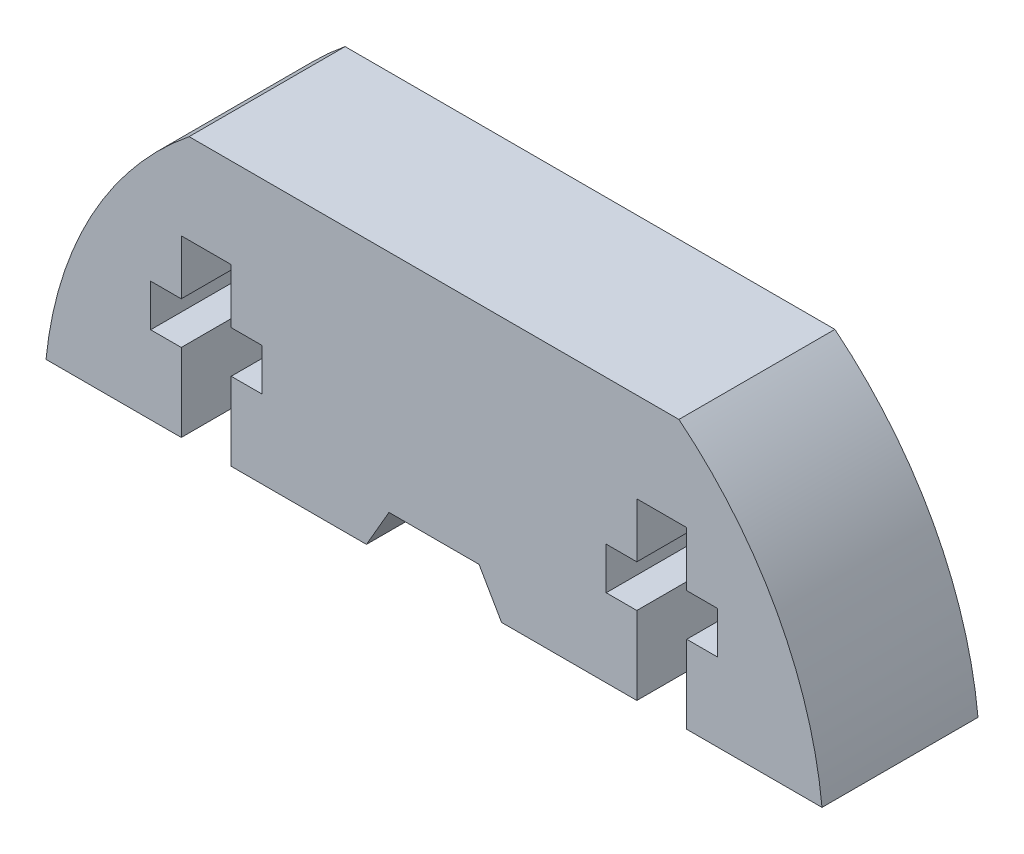
ISO-10303-21;
HEADER;
FILE_DESCRIPTION(('STEP AP214'),'2;1');
FILE_NAME('part.step','',(''),(''),'','','');
FILE_SCHEMA(('AUTOMOTIVE_DESIGN { 1 0 10303 214 1 1 1 1 }'));
ENDSEC;
DATA;
#1=APPLICATION_CONTEXT('core data for automotive mechanical design processes');
#2=APPLICATION_PROTOCOL_DEFINITION('international standard','automotive_design',2000,#1);
#3=PRODUCT_CONTEXT('',#1,'mechanical');
#4=PRODUCT('Part','Part','',(#3));
#5=PRODUCT_RELATED_PRODUCT_CATEGORY('part','',(#4));
#6=PRODUCT_DEFINITION_FORMATION('','',#4);
#7=PRODUCT_DEFINITION_CONTEXT('part definition',#1,'design');
#8=PRODUCT_DEFINITION('design','',#6,#7);
#9=PRODUCT_DEFINITION_SHAPE('','',#8);
#10=(LENGTH_UNIT() NAMED_UNIT(*) SI_UNIT(.MILLI.,.METRE.));
#11=(NAMED_UNIT(*) PLANE_ANGLE_UNIT() SI_UNIT($,.RADIAN.));
#12=(NAMED_UNIT(*) SI_UNIT($,.STERADIAN.) SOLID_ANGLE_UNIT());
#13=UNCERTAINTY_MEASURE_WITH_UNIT(LENGTH_MEASURE(1.E-05),#10,'distance_accuracy_value','');
#14=(GEOMETRIC_REPRESENTATION_CONTEXT(3) GLOBAL_UNCERTAINTY_ASSIGNED_CONTEXT((#13)) GLOBAL_UNIT_ASSIGNED_CONTEXT((#10,
#11,#12)) REPRESENTATION_CONTEXT('',''));
#15=CARTESIAN_POINT('',(0.,0.,0.));
#16=DIRECTION('',(0.,0.,1.));
#17=DIRECTION('',(1.,0.,0.));
#18=AXIS2_PLACEMENT_3D('',#15,#16,#17);
#19=CARTESIAN_POINT('',(0.,2.50000000000001,10.));
#20=DIRECTION('',(0.,1.,0.));
#21=DIRECTION('',(-1.,0.,0.));
#22=AXIS2_PLACEMENT_3D('',#19,#20,#21);
#23=PLANE('',#22);
#24=DIRECTION('',(1.,0.,0.));
#25=VECTOR('',#24,1.);
#26=CARTESIAN_POINT('',(0.,2.50000000000001,0.));
#27=LINE('',#26,#25);
#28=CARTESIAN_POINT('',(16.2024064732938,2.5,0.));
#29=VERTEX_POINT('',#28);
#30=CARTESIAN_POINT('',(24.8746859276655,2.5,0.));
#31=VERTEX_POINT('',#30);
#32=EDGE_CURVE('E305',#29,#31,#27,.T.);
#33=ORIENTED_EDGE('',*,*,#32,.T.);
#34=DIRECTION('',(0.,0.,-1.));
#35=VECTOR('',#34,1.);
#36=CARTESIAN_POINT('',(24.8746859276655,2.5,10.));
#37=LINE('',#36,#35);
#38=CARTESIAN_POINT('',(24.8746859276655,2.5,10.));
#39=VERTEX_POINT('',#38);
#40=EDGE_CURVE('E11',#39,#31,#37,.T.);
#41=ORIENTED_EDGE('',*,*,#40,.F.);
#42=DIRECTION('',(1.,0.,0.));
#43=VECTOR('',#42,1.);
#44=CARTESIAN_POINT('',(0.,2.50000000000001,10.));
#45=LINE('',#44,#43);
#46=CARTESIAN_POINT('',(16.2024064732938,2.5,10.));
#47=VERTEX_POINT('',#46);
#48=EDGE_CURVE('E291',#47,#39,#45,.T.);
#49=ORIENTED_EDGE('',*,*,#48,.F.);
#50=DIRECTION('',(0.,0.,-1.));
#51=VECTOR('',#50,1.);
#52=CARTESIAN_POINT('',(16.2024064732938,2.5,10.));
#53=LINE('',#52,#51);
#54=EDGE_CURVE('E52',#47,#29,#53,.T.);
#55=ORIENTED_EDGE('',*,*,#54,.T.);
#56=EDGE_LOOP('',(#33,#41,#49,#55));
#57=FACE_BOUND('',#56,.T.);
#58=ADVANCED_FACE('F35',(#57),#23,.F.);
#59=CARTESIAN_POINT('',(0.,0.,10.));
#60=DIRECTION('',(0.,0.,-1.));
#61=DIRECTION('',(-1.,0.,0.));
#62=AXIS2_PLACEMENT_3D('',#59,#60,#61);
#63=CYLINDRICAL_SURFACE('',#62,25.);
#64=CARTESIAN_POINT('',(0.,0.,0.));
#65=DIRECTION('',(0.,0.,1.));
#66=DIRECTION('',(1.,0.,0.));
#67=AXIS2_PLACEMENT_3D('',#64,#65,#66);
#68=CIRCLE('',#67,25.);
#69=CARTESIAN_POINT('',(15.700660457168,19.454800466947,0.));
#70=VERTEX_POINT('',#69);
#71=EDGE_CURVE('E307',#31,#70,#68,.T.);
#72=ORIENTED_EDGE('',*,*,#71,.T.);
#73=DIRECTION('',(0.,0.,-1.));
#74=VECTOR('',#73,1.);
#75=CARTESIAN_POINT('',(15.700660457168,19.454800466947,10.));
#76=LINE('',#75,#74);
#77=CARTESIAN_POINT('',(15.700660457168,19.454800466947,10.));
#78=VERTEX_POINT('',#77);
#79=EDGE_CURVE('E44',#78,#70,#76,.T.);
#80=ORIENTED_EDGE('',*,*,#79,.F.);
#81=CARTESIAN_POINT('',(0.,0.,10.));
#82=DIRECTION('',(0.,0.,1.));
#83=DIRECTION('',(1.,0.,0.));
#84=AXIS2_PLACEMENT_3D('',#81,#82,#83);
#85=CIRCLE('',#84,25.);
#86=EDGE_CURVE('E162',#39,#78,#85,.T.);
#87=ORIENTED_EDGE('',*,*,#86,.F.);
#88=ORIENTED_EDGE('',*,*,#40,.T.);
#89=EDGE_LOOP('',(#72,#80,#87,#88));
#90=FACE_BOUND('',#89,.T.);
#91=ADVANCED_FACE('F37',(#90),#63,.T.);
#92=CARTESIAN_POINT('',(0.,19.454800466947,10.));
#93=DIRECTION('',(0.,1.,0.));
#94=DIRECTION('',(0.,0.,1.));
#95=AXIS2_PLACEMENT_3D('',#92,#93,#94);
#96=PLANE('',#95);
#97=DIRECTION('',(1.,0.,0.));
#98=VECTOR('',#97,1.);
#99=CARTESIAN_POINT('',(0.,19.454800466947,0.));
#100=LINE('',#99,#98);
#101=CARTESIAN_POINT('',(-15.700660457168,19.454800466947,0.));
#102=VERTEX_POINT('',#101);
#103=EDGE_CURVE('E311',#102,#70,#100,.T.);
#104=ORIENTED_EDGE('',*,*,#103,.F.);
#105=DIRECTION('',(0.,0.,-1.));
#106=VECTOR('',#105,1.);
#107=CARTESIAN_POINT('',(-15.700660457168,19.454800466947,10.));
#108=LINE('',#107,#106);
#109=CARTESIAN_POINT('',(-15.700660457168,19.454800466947,10.));
#110=VERTEX_POINT('',#109);
#111=EDGE_CURVE('E433',#110,#102,#108,.T.);
#112=ORIENTED_EDGE('',*,*,#111,.F.);
#113=DIRECTION('',(1.,0.,0.));
#114=VECTOR('',#113,1.);
#115=CARTESIAN_POINT('',(0.,19.454800466947,10.));
#116=LINE('',#115,#114);
#117=EDGE_CURVE('E439',#110,#78,#116,.T.);
#118=ORIENTED_EDGE('',*,*,#117,.T.);
#119=ORIENTED_EDGE('',*,*,#79,.T.);
#120=EDGE_LOOP('',(#104,#112,#118,#119));
#121=FACE_BOUND('',#120,.T.);
#122=ADVANCED_FACE('F437',(#121),#96,.T.);
#123=CARTESIAN_POINT('',(0.,0.,10.));
#124=DIRECTION('',(0.,0.,-1.));
#125=DIRECTION('',(-1.,0.,0.));
#126=AXIS2_PLACEMENT_3D('',#123,#124,#125);
#127=CYLINDRICAL_SURFACE('',#126,25.);
#128=CARTESIAN_POINT('',(0.,0.,0.));
#129=DIRECTION('',(0.,0.,1.));
#130=DIRECTION('',(1.,0.,0.));
#131=AXIS2_PLACEMENT_3D('',#128,#129,#130);
#132=CIRCLE('',#131,25.);
#133=CARTESIAN_POINT('',(-24.8746859276655,2.5,0.));
#134=VERTEX_POINT('',#133);
#135=EDGE_CURVE('E314',#102,#134,#132,.T.);
#136=ORIENTED_EDGE('',*,*,#135,.T.);
#137=DIRECTION('',(0.,0.,-1.));
#138=VECTOR('',#137,1.);
#139=CARTESIAN_POINT('',(-24.8746859276655,2.5,10.));
#140=LINE('',#139,#138);
#141=CARTESIAN_POINT('',(-24.8746859276655,2.5,10.));
#142=VERTEX_POINT('',#141);
#143=EDGE_CURVE('E431',#142,#134,#140,.T.);
#144=ORIENTED_EDGE('',*,*,#143,.F.);
#145=CARTESIAN_POINT('',(0.,0.,10.));
#146=DIRECTION('',(0.,0.,1.));
#147=DIRECTION('',(1.,0.,0.));
#148=AXIS2_PLACEMENT_3D('',#145,#146,#147);
#149=CIRCLE('',#148,25.);
#150=EDGE_CURVE('E451',#110,#142,#149,.T.);
#151=ORIENTED_EDGE('',*,*,#150,.F.);
#152=ORIENTED_EDGE('',*,*,#111,.T.);
#153=EDGE_LOOP('',(#136,#144,#151,#152));
#154=FACE_BOUND('',#153,.T.);
#155=ADVANCED_FACE('F448',(#154),#127,.T.);
#156=CARTESIAN_POINT('',(0.,2.5,10.));
#157=DIRECTION('',(0.,-1.,0.));
#158=DIRECTION('',(1.,0.,0.));
#159=AXIS2_PLACEMENT_3D('',#156,#157,#158);
#160=PLANE('',#159);
#161=DIRECTION('',(-1.,0.,0.));
#162=VECTOR('',#161,1.);
#163=CARTESIAN_POINT('',(0.,2.5,0.));
#164=LINE('',#163,#162);
#165=CARTESIAN_POINT('',(-16.2024064732938,2.5,0.));
#166=VERTEX_POINT('',#165);
#167=EDGE_CURVE('E317',#166,#134,#164,.T.);
#168=ORIENTED_EDGE('',*,*,#167,.F.);
#169=DIRECTION('',(0.,0.,-1.));
#170=VECTOR('',#169,1.);
#171=CARTESIAN_POINT('',(-16.2024064732938,2.5,10.));
#172=LINE('',#171,#170);
#173=CARTESIAN_POINT('',(-16.2024064732938,2.5,10.));
#174=VERTEX_POINT('',#173);
#175=EDGE_CURVE('E429',#174,#166,#172,.T.);
#176=ORIENTED_EDGE('',*,*,#175,.F.);
#177=DIRECTION('',(-1.,0.,0.));
#178=VECTOR('',#177,1.);
#179=CARTESIAN_POINT('',(0.,2.5,10.));
#180=LINE('',#179,#178);
#181=EDGE_CURVE('E453',#174,#142,#180,.T.);
#182=ORIENTED_EDGE('',*,*,#181,.T.);
#183=ORIENTED_EDGE('',*,*,#143,.T.);
#184=EDGE_LOOP('',(#168,#176,#182,#183));
#185=FACE_BOUND('',#184,.T.);
#186=ADVANCED_FACE('F567',(#185),#160,.T.);
#187=CARTESIAN_POINT('',(-16.2024064732938,0.,10.));
#188=DIRECTION('',(-1.,0.,0.));
#189=DIRECTION('',(0.,0.,1.));
#190=AXIS2_PLACEMENT_3D('',#187,#188,#189);
#191=PLANE('',#190);
#192=DIRECTION('',(0.,1.,0.));
#193=VECTOR('',#192,1.);
#194=CARTESIAN_POINT('',(-16.2024064732938,0.,0.));
#195=LINE('',#194,#193);
#196=CARTESIAN_POINT('',(-16.2024064732938,7.5,0.));
#197=VERTEX_POINT('',#196);
#198=EDGE_CURVE('E320',#166,#197,#195,.T.);
#199=ORIENTED_EDGE('',*,*,#198,.T.);
#200=DIRECTION('',(0.,0.,-1.));
#201=VECTOR('',#200,1.);
#202=CARTESIAN_POINT('',(-16.2024064732938,7.5,10.));
#203=LINE('',#202,#201);
#204=CARTESIAN_POINT('',(-16.2024064732938,7.5,10.));
#205=VERTEX_POINT('',#204);
#206=EDGE_CURVE('E426',#205,#197,#203,.T.);
#207=ORIENTED_EDGE('',*,*,#206,.F.);
#208=DIRECTION('',(0.,1.,0.));
#209=VECTOR('',#208,1.);
#210=CARTESIAN_POINT('',(-16.2024064732938,0.,10.));
#211=LINE('',#210,#209);
#212=EDGE_CURVE('E459',#174,#205,#211,.T.);
#213=ORIENTED_EDGE('',*,*,#212,.F.);
#214=ORIENTED_EDGE('',*,*,#175,.T.);
#215=EDGE_LOOP('',(#199,#207,#213,#214));
#216=FACE_BOUND('',#215,.T.);
#217=ADVANCED_FACE('F594',(#216),#191,.F.);
#218=CARTESIAN_POINT('',(0.,7.5,10.));
#219=DIRECTION('',(0.,-1.,0.));
#220=DIRECTION('',(0.,0.,-1.));
#221=AXIS2_PLACEMENT_3D('',#218,#219,#220);
#222=PLANE('',#221);
#223=DIRECTION('',(-1.,0.,0.));
#224=VECTOR('',#223,1.);
#225=CARTESIAN_POINT('',(0.,7.5,0.));
#226=LINE('',#225,#224);
#227=CARTESIAN_POINT('',(-18.1652483555794,7.5,0.));
#228=VERTEX_POINT('',#227);
#229=EDGE_CURVE('E323',#197,#228,#226,.T.);
#230=ORIENTED_EDGE('',*,*,#229,.T.);
#231=DIRECTION('',(0.,0.,-1.));
#232=VECTOR('',#231,1.);
#233=CARTESIAN_POINT('',(-18.1652483555794,7.5,10.));
#234=LINE('',#233,#232);
#235=CARTESIAN_POINT('',(-18.1652483555794,7.5,10.));
#236=VERTEX_POINT('',#235);
#237=EDGE_CURVE('E423',#236,#228,#234,.T.);
#238=ORIENTED_EDGE('',*,*,#237,.F.);
#239=DIRECTION('',(-1.,0.,0.));
#240=VECTOR('',#239,1.);
#241=CARTESIAN_POINT('',(0.,7.5,10.));
#242=LINE('',#241,#240);
#243=EDGE_CURVE('E462',#205,#236,#242,.T.);
#244=ORIENTED_EDGE('',*,*,#243,.F.);
#245=ORIENTED_EDGE('',*,*,#206,.T.);
#246=EDGE_LOOP('',(#230,#238,#244,#245));
#247=FACE_BOUND('',#246,.T.);
#248=ADVANCED_FACE('F577',(#247),#222,.F.);
#249=CARTESIAN_POINT('',(-18.1652483555794,0.,10.));
#250=DIRECTION('',(-1.,0.,0.));
#251=DIRECTION('',(0.,0.,1.));
#252=AXIS2_PLACEMENT_3D('',#249,#250,#251);
#253=PLANE('',#252);
#254=DIRECTION('',(0.,1.,0.));
#255=VECTOR('',#254,1.);
#256=CARTESIAN_POINT('',(-18.1652483555794,0.,0.));
#257=LINE('',#256,#255);
#258=CARTESIAN_POINT('',(-18.1652483555794,10.2,0.));
#259=VERTEX_POINT('',#258);
#260=EDGE_CURVE('E326',#228,#259,#257,.T.);
#261=ORIENTED_EDGE('',*,*,#260,.T.);
#262=DIRECTION('',(0.,0.,-1.));
#263=VECTOR('',#262,1.);
#264=CARTESIAN_POINT('',(-18.1652483555794,10.2,10.));
#265=LINE('',#264,#263);
#266=CARTESIAN_POINT('',(-18.1652483555794,10.2,10.));
#267=VERTEX_POINT('',#266);
#268=EDGE_CURVE('E421',#267,#259,#265,.T.);
#269=ORIENTED_EDGE('',*,*,#268,.F.);
#270=DIRECTION('',(0.,1.,0.));
#271=VECTOR('',#270,1.);
#272=CARTESIAN_POINT('',(-18.1652483555794,0.,10.));
#273=LINE('',#272,#271);
#274=EDGE_CURVE('E465',#236,#267,#273,.T.);
#275=ORIENTED_EDGE('',*,*,#274,.F.);
#276=ORIENTED_EDGE('',*,*,#237,.T.);
#277=EDGE_LOOP('',(#261,#269,#275,#276));
#278=FACE_BOUND('',#277,.T.);
#279=ADVANCED_FACE('F595',(#278),#253,.F.);
#280=CARTESIAN_POINT('',(0.,10.2,10.));
#281=DIRECTION('',(0.,-1.,0.));
#282=DIRECTION('',(0.,0.,-1.));
#283=AXIS2_PLACEMENT_3D('',#280,#281,#282);
#284=PLANE('',#283);
#285=DIRECTION('',(-1.,0.,0.));
#286=VECTOR('',#285,1.);
#287=CARTESIAN_POINT('',(0.,10.2,0.));
#288=LINE('',#287,#286);
#289=CARTESIAN_POINT('',(-16.2024064732938,10.2,0.));
#290=VERTEX_POINT('',#289);
#291=EDGE_CURVE('E330',#290,#259,#288,.T.);
#292=ORIENTED_EDGE('',*,*,#291,.F.);
#293=DIRECTION('',(0.,0.,-1.));
#294=VECTOR('',#293,1.);
#295=CARTESIAN_POINT('',(-16.2024064732938,10.2,10.));
#296=LINE('',#295,#294);
#297=CARTESIAN_POINT('',(-16.2024064732938,10.2,10.));
#298=VERTEX_POINT('',#297);
#299=EDGE_CURVE('E419',#298,#290,#296,.T.);
#300=ORIENTED_EDGE('',*,*,#299,.F.);
#301=DIRECTION('',(-1.,0.,0.));
#302=VECTOR('',#301,1.);
#303=CARTESIAN_POINT('',(0.,10.2,10.));
#304=LINE('',#303,#302);
#305=EDGE_CURVE('E468',#298,#267,#304,.T.);
#306=ORIENTED_EDGE('',*,*,#305,.T.);
#307=ORIENTED_EDGE('',*,*,#268,.T.);
#308=EDGE_LOOP('',(#292,#300,#306,#307));
#309=FACE_BOUND('',#308,.T.);
#310=ADVANCED_FACE('F585',(#309),#284,.T.);
#311=CARTESIAN_POINT('',(-16.2024064732938,13.7,0.));
#312=VERTEX_POINT('',#311);
#313=EDGE_CURVE('E324',#290,#312,#195,.T.);
#314=ORIENTED_EDGE('',*,*,#313,.T.);
#315=DIRECTION('',(0.,0.,-1.));
#316=VECTOR('',#315,1.);
#317=CARTESIAN_POINT('',(-16.2024064732938,13.7,10.));
#318=LINE('',#317,#316);
#319=CARTESIAN_POINT('',(-16.2024064732938,13.7,10.));
#320=VERTEX_POINT('',#319);
#321=EDGE_CURVE('E416',#320,#312,#318,.T.);
#322=ORIENTED_EDGE('',*,*,#321,.F.);
#323=EDGE_CURVE('E463',#298,#320,#211,.T.);
#324=ORIENTED_EDGE('',*,*,#323,.F.);
#325=ORIENTED_EDGE('',*,*,#299,.T.);
#326=EDGE_LOOP('',(#314,#322,#324,#325));
#327=FACE_BOUND('',#326,.T.);
#328=ADVANCED_FACE('F589',(#327),#191,.F.);
#329=CARTESIAN_POINT('',(0.,13.7,10.));
#330=DIRECTION('',(0.,1.,0.));
#331=DIRECTION('',(-1.,0.,0.));
#332=AXIS2_PLACEMENT_3D('',#329,#330,#331);
#333=PLANE('',#332);
#334=DIRECTION('',(1.,0.,0.));
#335=VECTOR('',#334,1.);
#336=CARTESIAN_POINT('',(0.,13.7,0.));
#337=LINE('',#336,#335);
#338=CARTESIAN_POINT('',(-13.0024064732938,13.7,0.));
#339=VERTEX_POINT('',#338);
#340=EDGE_CURVE('E334',#312,#339,#337,.T.);
#341=ORIENTED_EDGE('',*,*,#340,.T.);
#342=DIRECTION('',(0.,0.,-1.));
#343=VECTOR('',#342,1.);
#344=CARTESIAN_POINT('',(-13.0024064732938,13.7,10.));
#345=LINE('',#344,#343);
#346=CARTESIAN_POINT('',(-13.0024064732938,13.7,10.));
#347=VERTEX_POINT('',#346);
#348=EDGE_CURVE('E414',#347,#339,#345,.T.);
#349=ORIENTED_EDGE('',*,*,#348,.F.);
#350=DIRECTION('',(1.,0.,0.));
#351=VECTOR('',#350,1.);
#352=CARTESIAN_POINT('',(0.,13.7,10.));
#353=LINE('',#352,#351);
#354=EDGE_CURVE('E472',#320,#347,#353,.T.);
#355=ORIENTED_EDGE('',*,*,#354,.F.);
#356=ORIENTED_EDGE('',*,*,#321,.T.);
#357=EDGE_LOOP('',(#341,#349,#355,#356));
#358=FACE_BOUND('',#357,.T.);
#359=ADVANCED_FACE('F586',(#358),#333,.F.);
#360=CARTESIAN_POINT('',(-13.0024064732938,0.,10.));
#361=DIRECTION('',(-1.,0.,0.));
#362=DIRECTION('',(0.,0.,1.));
#363=AXIS2_PLACEMENT_3D('',#360,#361,#362);
#364=PLANE('',#363);
#365=DIRECTION('',(0.,1.,0.));
#366=VECTOR('',#365,1.);
#367=CARTESIAN_POINT('',(-13.0024064732938,0.,0.));
#368=LINE('',#367,#366);
#369=CARTESIAN_POINT('',(-13.0024064732938,10.2,0.));
#370=VERTEX_POINT('',#369);
#371=EDGE_CURVE('E337',#370,#339,#368,.T.);
#372=ORIENTED_EDGE('',*,*,#371,.F.);
#373=DIRECTION('',(0.,0.,-1.));
#374=VECTOR('',#373,1.);
#375=CARTESIAN_POINT('',(-13.0024064732938,10.2,10.));
#376=LINE('',#375,#374);
#377=CARTESIAN_POINT('',(-13.0024064732938,10.2,10.));
#378=VERTEX_POINT('',#377);
#379=EDGE_CURVE('E412',#378,#370,#376,.T.);
#380=ORIENTED_EDGE('',*,*,#379,.F.);
#381=DIRECTION('',(0.,1.,0.));
#382=VECTOR('',#381,1.);
#383=CARTESIAN_POINT('',(-13.0024064732938,0.,10.));
#384=LINE('',#383,#382);
#385=EDGE_CURVE('E474',#378,#347,#384,.T.);
#386=ORIENTED_EDGE('',*,*,#385,.T.);
#387=ORIENTED_EDGE('',*,*,#348,.T.);
#388=EDGE_LOOP('',(#372,#380,#386,#387));
#389=FACE_BOUND('',#388,.T.);
#390=ADVANCED_FACE('F572',(#389),#364,.T.);
#391=CARTESIAN_POINT('',(-11.0395645910083,10.2,0.));
#392=VERTEX_POINT('',#391);
#393=EDGE_CURVE('E333',#392,#370,#288,.T.);
#394=ORIENTED_EDGE('',*,*,#393,.F.);
#395=DIRECTION('',(0.,0.,-1.));
#396=VECTOR('',#395,1.);
#397=CARTESIAN_POINT('',(-11.0395645910083,10.2,10.));
#398=LINE('',#397,#396);
#399=CARTESIAN_POINT('',(-11.0395645910083,10.2,10.));
#400=VERTEX_POINT('',#399);
#401=EDGE_CURVE('E410',#400,#392,#398,.T.);
#402=ORIENTED_EDGE('',*,*,#401,.F.);
#403=EDGE_CURVE('E471',#400,#378,#304,.T.);
#404=ORIENTED_EDGE('',*,*,#403,.T.);
#405=ORIENTED_EDGE('',*,*,#379,.T.);
#406=EDGE_LOOP('',(#394,#402,#404,#405));
#407=FACE_BOUND('',#406,.T.);
#408=ADVANCED_FACE('F580',(#407),#284,.T.);
#409=CARTESIAN_POINT('',(-11.0395645910083,0.,10.));
#410=DIRECTION('',(-1.,0.,0.));
#411=DIRECTION('',(0.,0.,1.));
#412=AXIS2_PLACEMENT_3D('',#409,#410,#411);
#413=PLANE('',#412);
#414=DIRECTION('',(0.,1.,0.));
#415=VECTOR('',#414,1.);
#416=CARTESIAN_POINT('',(-11.0395645910083,0.,0.));
#417=LINE('',#416,#415);
#418=CARTESIAN_POINT('',(-11.0395645910083,7.5,0.));
#419=VERTEX_POINT('',#418);
#420=EDGE_CURVE('E341',#419,#392,#417,.T.);
#421=ORIENTED_EDGE('',*,*,#420,.F.);
#422=DIRECTION('',(0.,0.,-1.));
#423=VECTOR('',#422,1.);
#424=CARTESIAN_POINT('',(-11.0395645910083,7.5,10.));
#425=LINE('',#424,#423);
#426=CARTESIAN_POINT('',(-11.0395645910083,7.5,10.));
#427=VERTEX_POINT('',#426);
#428=EDGE_CURVE('E408',#427,#419,#425,.T.);
#429=ORIENTED_EDGE('',*,*,#428,.F.);
#430=DIRECTION('',(0.,1.,0.));
#431=VECTOR('',#430,1.);
#432=CARTESIAN_POINT('',(-11.0395645910083,0.,10.));
#433=LINE('',#432,#431);
#434=EDGE_CURVE('E478',#427,#400,#433,.T.);
#435=ORIENTED_EDGE('',*,*,#434,.T.);
#436=ORIENTED_EDGE('',*,*,#401,.T.);
#437=EDGE_LOOP('',(#421,#429,#435,#436));
#438=FACE_BOUND('',#437,.T.);
#439=ADVANCED_FACE('F575',(#438),#413,.T.);
#440=CARTESIAN_POINT('',(-13.0024064732938,7.5,0.));
#441=VERTEX_POINT('',#440);
#442=EDGE_CURVE('E327',#419,#441,#226,.T.);
#443=ORIENTED_EDGE('',*,*,#442,.T.);
#444=DIRECTION('',(0.,0.,-1.));
#445=VECTOR('',#444,1.);
#446=CARTESIAN_POINT('',(-13.0024064732938,7.5,10.));
#447=LINE('',#446,#445);
#448=CARTESIAN_POINT('',(-13.0024064732938,7.5,10.));
#449=VERTEX_POINT('',#448);
#450=EDGE_CURVE('E406',#449,#441,#447,.T.);
#451=ORIENTED_EDGE('',*,*,#450,.F.);
#452=EDGE_CURVE('E466',#427,#449,#242,.T.);
#453=ORIENTED_EDGE('',*,*,#452,.F.);
#454=ORIENTED_EDGE('',*,*,#428,.T.);
#455=EDGE_LOOP('',(#443,#451,#453,#454));
#456=FACE_BOUND('',#455,.T.);
#457=ADVANCED_FACE('F570',(#456),#222,.F.);
#458=CARTESIAN_POINT('',(-13.0024064732938,2.5,0.));
#459=VERTEX_POINT('',#458);
#460=EDGE_CURVE('E340',#459,#441,#368,.T.);
#461=ORIENTED_EDGE('',*,*,#460,.F.);
#462=DIRECTION('',(0.,0.,-1.));
#463=VECTOR('',#462,1.);
#464=CARTESIAN_POINT('',(-13.0024064732938,2.5,10.));
#465=LINE('',#464,#463);
#466=CARTESIAN_POINT('',(-13.0024064732938,2.5,10.));
#467=VERTEX_POINT('',#466);
#468=EDGE_CURVE('E404',#467,#459,#465,.T.);
#469=ORIENTED_EDGE('',*,*,#468,.F.);
#470=EDGE_CURVE('E477',#467,#449,#384,.T.);
#471=ORIENTED_EDGE('',*,*,#470,.T.);
#472=ORIENTED_EDGE('',*,*,#450,.T.);
#473=EDGE_LOOP('',(#461,#469,#471,#472));
#474=FACE_BOUND('',#473,.T.);
#475=ADVANCED_FACE('F565',(#474),#364,.T.);
#476=CARTESIAN_POINT('',(-4.33012701892219,2.5,0.));
#477=VERTEX_POINT('',#476);
#478=EDGE_CURVE('E321',#477,#459,#164,.T.);
#479=ORIENTED_EDGE('',*,*,#478,.F.);
#480=DIRECTION('',(0.,0.,-1.));
#481=VECTOR('',#480,1.);
#482=CARTESIAN_POINT('',(-4.33012701892219,2.5,10.));
#483=LINE('',#482,#481);
#484=CARTESIAN_POINT('',(-4.33012701892219,2.5,10.));
#485=VERTEX_POINT('',#484);
#486=EDGE_CURVE('E402',#485,#477,#483,.T.);
#487=ORIENTED_EDGE('',*,*,#486,.F.);
#488=EDGE_CURVE('E460',#485,#467,#180,.T.);
#489=ORIENTED_EDGE('',*,*,#488,.T.);
#490=ORIENTED_EDGE('',*,*,#468,.T.);
#491=EDGE_LOOP('',(#479,#487,#489,#490));
#492=FACE_BOUND('',#491,.T.);
#493=ADVANCED_FACE('F561',(#492),#160,.T.);
#494=CARTESIAN_POINT('',(-4.33012701892221,2.49999999999998,10.));
#495=DIRECTION('',(0.866025403784442,-0.499999999999995,0.));
#496=DIRECTION('',(0.499999999999995,0.866025403784442,0.));
#497=AXIS2_PLACEMENT_3D('',#494,#495,#496);
#498=PLANE('',#497);
#499=DIRECTION('',(-0.499999999999995,-0.866025403784442,0.));
#500=VECTOR('',#499,1.);
#501=CARTESIAN_POINT('',(-4.33012701892221,2.49999999999998,0.));
#502=LINE('',#501,#500);
#503=CARTESIAN_POINT('',(-2.88675134594815,4.99999999999999,0.));
#504=VERTEX_POINT('',#503);
#505=EDGE_CURVE('E344',#504,#477,#502,.T.);
#506=ORIENTED_EDGE('',*,*,#505,.F.);
#507=DIRECTION('',(0.,0.,-1.));
#508=VECTOR('',#507,1.);
#509=CARTESIAN_POINT('',(-2.88675134594815,4.99999999999999,10.));
#510=LINE('',#509,#508);
#511=CARTESIAN_POINT('',(-2.88675134594815,4.99999999999999,10.));
#512=VERTEX_POINT('',#511);
#513=EDGE_CURVE('E400',#512,#504,#510,.T.);
#514=ORIENTED_EDGE('',*,*,#513,.F.);
#515=DIRECTION('',(-0.499999999999995,-0.866025403784442,0.));
#516=VECTOR('',#515,1.);
#517=CARTESIAN_POINT('',(-4.33012701892221,2.49999999999998,10.));
#518=LINE('',#517,#516);
#519=EDGE_CURVE('E481',#512,#485,#518,.T.);
#520=ORIENTED_EDGE('',*,*,#519,.T.);
#521=ORIENTED_EDGE('',*,*,#486,.T.);
#522=EDGE_LOOP('',(#506,#514,#520,#521));
#523=FACE_BOUND('',#522,.T.);
#524=ADVANCED_FACE('F556',(#523),#498,.T.);
#525=CARTESIAN_POINT('',(0.,5.,10.));
#526=DIRECTION('',(0.,-1.,0.));
#527=DIRECTION('',(1.,0.,0.));
#528=AXIS2_PLACEMENT_3D('',#525,#526,#527);
#529=PLANE('',#528);
#530=DIRECTION('',(-1.,0.,0.));
#531=VECTOR('',#530,1.);
#532=CARTESIAN_POINT('',(0.,5.,0.));
#533=LINE('',#532,#531);
#534=CARTESIAN_POINT('',(2.88675134594812,5.00000000000001,0.));
#535=VERTEX_POINT('',#534);
#536=EDGE_CURVE('E347',#535,#504,#533,.T.);
#537=ORIENTED_EDGE('',*,*,#536,.F.);
#538=DIRECTION('',(0.,0.,-1.));
#539=VECTOR('',#538,1.);
#540=CARTESIAN_POINT('',(2.88675134594812,5.00000000000001,10.));
#541=LINE('',#540,#539);
#542=CARTESIAN_POINT('',(2.88675134594812,5.00000000000001,10.));
#543=VERTEX_POINT('',#542);
#544=EDGE_CURVE('E398',#543,#535,#541,.T.);
#545=ORIENTED_EDGE('',*,*,#544,.F.);
#546=DIRECTION('',(-1.,0.,0.));
#547=VECTOR('',#546,1.);
#548=CARTESIAN_POINT('',(0.,5.,10.));
#549=LINE('',#548,#547);
#550=EDGE_CURVE('E484',#543,#512,#549,.T.);
#551=ORIENTED_EDGE('',*,*,#550,.T.);
#552=ORIENTED_EDGE('',*,*,#513,.T.);
#553=EDGE_LOOP('',(#537,#545,#551,#552));
#554=FACE_BOUND('',#553,.T.);
#555=ADVANCED_FACE('F498',(#554),#529,.T.);
#556=CARTESIAN_POINT('',(4.33012701892219,2.50000000000001,10.));
#557=DIRECTION('',(-0.866025403784438,-0.500000000000001,0.));
#558=DIRECTION('',(0.500000000000001,-0.866025403784438,0.));
#559=AXIS2_PLACEMENT_3D('',#556,#557,#558);
#560=PLANE('',#559);
#561=DIRECTION('',(-0.500000000000001,0.866025403784438,0.));
#562=VECTOR('',#561,1.);
#563=CARTESIAN_POINT('',(4.33012701892219,2.50000000000001,0.));
#564=LINE('',#563,#562);
#565=CARTESIAN_POINT('',(4.33012701892219,2.50000000000001,0.));
#566=VERTEX_POINT('',#565);
#567=EDGE_CURVE('E350',#566,#535,#564,.T.);
#568=ORIENTED_EDGE('',*,*,#567,.F.);
#569=DIRECTION('',(0.,0.,-1.));
#570=VECTOR('',#569,1.);
#571=CARTESIAN_POINT('',(4.33012701892219,2.50000000000001,10.));
#572=LINE('',#571,#570);
#573=CARTESIAN_POINT('',(4.33012701892219,2.50000000000001,10.));
#574=VERTEX_POINT('',#573);
#575=EDGE_CURVE('E396',#574,#566,#572,.T.);
#576=ORIENTED_EDGE('',*,*,#575,.F.);
#577=DIRECTION('',(-0.500000000000001,0.866025403784438,0.));
#578=VECTOR('',#577,1.);
#579=CARTESIAN_POINT('',(4.33012701892219,2.50000000000001,10.));
#580=LINE('',#579,#578);
#581=EDGE_CURVE('E289',#574,#543,#580,.T.);
#582=ORIENTED_EDGE('',*,*,#581,.T.);
#583=ORIENTED_EDGE('',*,*,#544,.T.);
#584=EDGE_LOOP('',(#568,#576,#582,#583));
#585=FACE_BOUND('',#584,.T.);
#586=ADVANCED_FACE('F490',(#585),#560,.T.);
#587=CARTESIAN_POINT('',(13.0024064732938,2.5,0.));
#588=VERTEX_POINT('',#587);
#589=EDGE_CURVE('E308',#566,#588,#27,.T.);
#590=ORIENTED_EDGE('',*,*,#589,.T.);
#591=DIRECTION('',(0.,0.,-1.));
#592=VECTOR('',#591,1.);
#593=CARTESIAN_POINT('',(13.0024064732938,2.5,10.));
#594=LINE('',#593,#592);
#595=CARTESIAN_POINT('',(13.0024064732938,2.5,10.));
#596=VERTEX_POINT('',#595);
#597=EDGE_CURVE('E393',#596,#588,#594,.T.);
#598=ORIENTED_EDGE('',*,*,#597,.F.);
#599=EDGE_CURVE('E285',#574,#596,#45,.T.);
#600=ORIENTED_EDGE('',*,*,#599,.F.);
#601=ORIENTED_EDGE('',*,*,#575,.T.);
#602=EDGE_LOOP('',(#590,#598,#600,#601));
#603=FACE_BOUND('',#602,.T.);
#604=ADVANCED_FACE('F503',(#603),#23,.F.);
#605=CARTESIAN_POINT('',(13.0024064732938,0.,10.));
#606=DIRECTION('',(-1.,0.,0.));
#607=DIRECTION('',(0.,0.,1.));
#608=AXIS2_PLACEMENT_3D('',#605,#606,#607);
#609=PLANE('',#608);
#610=DIRECTION('',(0.,1.,0.));
#611=VECTOR('',#610,1.);
#612=CARTESIAN_POINT('',(13.0024064732938,0.,0.));
#613=LINE('',#612,#611);
#614=CARTESIAN_POINT('',(13.0024064732938,7.5,0.));
#615=VERTEX_POINT('',#614);
#616=EDGE_CURVE('E353',#588,#615,#613,.T.);
#617=ORIENTED_EDGE('',*,*,#616,.T.);
#618=DIRECTION('',(0.,0.,-1.));
#619=VECTOR('',#618,1.);
#620=CARTESIAN_POINT('',(13.0024064732938,7.5,10.));
#621=LINE('',#620,#619);
#622=CARTESIAN_POINT('',(13.0024064732938,7.5,10.));
#623=VERTEX_POINT('',#622);
#624=EDGE_CURVE('E391',#623,#615,#621,.T.);
#625=ORIENTED_EDGE('',*,*,#624,.F.);
#626=DIRECTION('',(0.,1.,0.));
#627=VECTOR('',#626,1.);
#628=CARTESIAN_POINT('',(13.0024064732938,0.,10.));
#629=LINE('',#628,#627);
#630=EDGE_CURVE('E281',#596,#623,#629,.T.);
#631=ORIENTED_EDGE('',*,*,#630,.F.);
#632=ORIENTED_EDGE('',*,*,#597,.T.);
#633=EDGE_LOOP('',(#617,#625,#631,#632));
#634=FACE_BOUND('',#633,.T.);
#635=ADVANCED_FACE('F505',(#634),#609,.F.);
#636=CARTESIAN_POINT('',(0.,7.5,10.));
#637=DIRECTION('',(0.,1.,0.));
#638=DIRECTION('',(0.,0.,1.));
#639=AXIS2_PLACEMENT_3D('',#636,#637,#638);
#640=PLANE('',#639);
#641=DIRECTION('',(1.,0.,0.));
#642=VECTOR('',#641,1.);
#643=CARTESIAN_POINT('',(0.,7.5,0.));
#644=LINE('',#643,#642);
#645=CARTESIAN_POINT('',(11.0395645910083,7.5,0.));
#646=VERTEX_POINT('',#645);
#647=EDGE_CURVE('E356',#646,#615,#644,.T.);
#648=ORIENTED_EDGE('',*,*,#647,.F.);
#649=DIRECTION('',(0.,0.,-1.));
#650=VECTOR('',#649,1.);
#651=CARTESIAN_POINT('',(11.0395645910083,7.5,10.));
#652=LINE('',#651,#650);
#653=CARTESIAN_POINT('',(11.0395645910083,7.5,10.));
#654=VERTEX_POINT('',#653);
#655=EDGE_CURVE('E389',#654,#646,#652,.T.);
#656=ORIENTED_EDGE('',*,*,#655,.F.);
#657=DIRECTION('',(1.,0.,0.));
#658=VECTOR('',#657,1.);
#659=CARTESIAN_POINT('',(0.,7.5,10.));
#660=LINE('',#659,#658);
#661=EDGE_CURVE('E274',#654,#623,#660,.T.);
#662=ORIENTED_EDGE('',*,*,#661,.T.);
#663=ORIENTED_EDGE('',*,*,#624,.T.);
#664=EDGE_LOOP('',(#648,#656,#662,#663));
#665=FACE_BOUND('',#664,.T.);
#666=ADVANCED_FACE('F507',(#665),#640,.T.);
#667=CARTESIAN_POINT('',(11.0395645910083,0.,10.));
#668=DIRECTION('',(-1.,0.,0.));
#669=DIRECTION('',(0.,0.,1.));
#670=AXIS2_PLACEMENT_3D('',#667,#668,#669);
#671=PLANE('',#670);
#672=DIRECTION('',(0.,1.,0.));
#673=VECTOR('',#672,1.);
#674=CARTESIAN_POINT('',(11.0395645910083,0.,0.));
#675=LINE('',#674,#673);
#676=CARTESIAN_POINT('',(11.0395645910083,10.2,0.));
#677=VERTEX_POINT('',#676);
#678=EDGE_CURVE('E360',#646,#677,#675,.T.);
#679=ORIENTED_EDGE('',*,*,#678,.T.);
#680=DIRECTION('',(0.,0.,-1.));
#681=VECTOR('',#680,1.);
#682=CARTESIAN_POINT('',(11.0395645910083,10.2,10.));
#683=LINE('',#682,#681);
#684=CARTESIAN_POINT('',(11.0395645910083,10.2,10.));
#685=VERTEX_POINT('',#684);
#686=EDGE_CURVE('E386',#685,#677,#683,.T.);
#687=ORIENTED_EDGE('',*,*,#686,.F.);
#688=DIRECTION('',(0.,1.,0.));
#689=VECTOR('',#688,1.);
#690=CARTESIAN_POINT('',(11.0395645910083,0.,10.));
#691=LINE('',#690,#689);
#692=EDGE_CURVE('E280',#654,#685,#691,.T.);
#693=ORIENTED_EDGE('',*,*,#692,.F.);
#694=ORIENTED_EDGE('',*,*,#655,.T.);
#695=EDGE_LOOP('',(#679,#687,#693,#694));
#696=FACE_BOUND('',#695,.T.);
#697=ADVANCED_FACE('F514',(#696),#671,.F.);
#698=CARTESIAN_POINT('',(0.,10.2,10.));
#699=DIRECTION('',(0.,1.,0.));
#700=DIRECTION('',(0.,0.,1.));
#701=AXIS2_PLACEMENT_3D('',#698,#699,#700);
#702=PLANE('',#701);
#703=DIRECTION('',(1.,0.,0.));
#704=VECTOR('',#703,1.);
#705=CARTESIAN_POINT('',(0.,10.2,0.));
#706=LINE('',#705,#704);
#707=CARTESIAN_POINT('',(13.0024064732938,10.2,0.));
#708=VERTEX_POINT('',#707);
#709=EDGE_CURVE('E363',#677,#708,#706,.T.);
#710=ORIENTED_EDGE('',*,*,#709,.T.);
#711=DIRECTION('',(0.,0.,-1.));
#712=VECTOR('',#711,1.);
#713=CARTESIAN_POINT('',(13.0024064732938,10.2,10.));
#714=LINE('',#713,#712);
#715=CARTESIAN_POINT('',(13.0024064732938,10.2,10.));
#716=VERTEX_POINT('',#715);
#717=EDGE_CURVE('E383',#716,#708,#714,.T.);
#718=ORIENTED_EDGE('',*,*,#717,.F.);
#719=DIRECTION('',(1.,0.,0.));
#720=VECTOR('',#719,1.);
#721=CARTESIAN_POINT('',(0.,10.2,10.));
#722=LINE('',#721,#720);
#723=EDGE_CURVE('E284',#685,#716,#722,.T.);
#724=ORIENTED_EDGE('',*,*,#723,.F.);
#725=ORIENTED_EDGE('',*,*,#686,.T.);
#726=EDGE_LOOP('',(#710,#718,#724,#725));
#727=FACE_BOUND('',#726,.T.);
#728=ADVANCED_FACE('F516',(#727),#702,.F.);
#729=CARTESIAN_POINT('',(13.0024064732938,13.7,0.));
#730=VERTEX_POINT('',#729);
#731=EDGE_CURVE('E357',#708,#730,#613,.T.);
#732=ORIENTED_EDGE('',*,*,#731,.T.);
#733=DIRECTION('',(0.,0.,-1.));
#734=VECTOR('',#733,1.);
#735=CARTESIAN_POINT('',(13.0024064732938,13.7,10.));
#736=LINE('',#735,#734);
#737=CARTESIAN_POINT('',(13.0024064732938,13.7,10.));
#738=VERTEX_POINT('',#737);
#739=EDGE_CURVE('E381',#738,#730,#736,.T.);
#740=ORIENTED_EDGE('',*,*,#739,.F.);
#741=EDGE_CURVE('E286',#716,#738,#629,.T.);
#742=ORIENTED_EDGE('',*,*,#741,.F.);
#743=ORIENTED_EDGE('',*,*,#717,.T.);
#744=EDGE_LOOP('',(#732,#740,#742,#743));
#745=FACE_BOUND('',#744,.T.);
#746=ADVANCED_FACE('F519',(#745),#609,.F.);
#747=CARTESIAN_POINT('',(0.,13.7,10.));
#748=DIRECTION('',(0.,-1.,0.));
#749=DIRECTION('',(1.,0.,0.));
#750=AXIS2_PLACEMENT_3D('',#747,#748,#749);
#751=PLANE('',#750);
#752=DIRECTION('',(-1.,0.,0.));
#753=VECTOR('',#752,1.);
#754=CARTESIAN_POINT('',(0.,13.7,0.));
#755=LINE('',#754,#753);
#756=CARTESIAN_POINT('',(16.2024064732938,13.7,0.));
#757=VERTEX_POINT('',#756);
#758=EDGE_CURVE('E366',#757,#730,#755,.T.);
#759=ORIENTED_EDGE('',*,*,#758,.F.);
#760=DIRECTION('',(0.,0.,-1.));
#761=VECTOR('',#760,1.);
#762=CARTESIAN_POINT('',(16.2024064732938,13.7,10.));
#763=LINE('',#762,#761);
#764=CARTESIAN_POINT('',(16.2024064732938,13.7,10.));
#765=VERTEX_POINT('',#764);
#766=EDGE_CURVE('E379',#765,#757,#763,.T.);
#767=ORIENTED_EDGE('',*,*,#766,.F.);
#768=DIRECTION('',(-1.,0.,0.));
#769=VECTOR('',#768,1.);
#770=CARTESIAN_POINT('',(0.,13.7,10.));
#771=LINE('',#770,#769);
#772=EDGE_CURVE('E293',#765,#738,#771,.T.);
#773=ORIENTED_EDGE('',*,*,#772,.T.);
#774=ORIENTED_EDGE('',*,*,#739,.T.);
#775=EDGE_LOOP('',(#759,#767,#773,#774));
#776=FACE_BOUND('',#775,.T.);
#777=ADVANCED_FACE('F522',(#776),#751,.T.);
#778=CARTESIAN_POINT('',(16.2024064732938,0.,10.));
#779=DIRECTION('',(-1.,0.,0.));
#780=DIRECTION('',(0.,0.,1.));
#781=AXIS2_PLACEMENT_3D('',#778,#779,#780);
#782=PLANE('',#781);
#783=DIRECTION('',(0.,1.,0.));
#784=VECTOR('',#783,1.);
#785=CARTESIAN_POINT('',(16.2024064732938,0.,0.));
#786=LINE('',#785,#784);
#787=CARTESIAN_POINT('',(16.2024064732938,10.2,0.));
#788=VERTEX_POINT('',#787);
#789=EDGE_CURVE('E369',#788,#757,#786,.T.);
#790=ORIENTED_EDGE('',*,*,#789,.F.);
#791=DIRECTION('',(0.,0.,-1.));
#792=VECTOR('',#791,1.);
#793=CARTESIAN_POINT('',(16.2024064732938,10.2,10.));
#794=LINE('',#793,#792);
#795=CARTESIAN_POINT('',(16.2024064732938,10.2,10.));
#796=VERTEX_POINT('',#795);
#797=EDGE_CURVE('E377',#796,#788,#794,.T.);
#798=ORIENTED_EDGE('',*,*,#797,.F.);
#799=DIRECTION('',(0.,1.,0.));
#800=VECTOR('',#799,1.);
#801=CARTESIAN_POINT('',(16.2024064732938,0.,10.));
#802=LINE('',#801,#800);
#803=EDGE_CURVE('E276',#796,#765,#802,.T.);
#804=ORIENTED_EDGE('',*,*,#803,.T.);
#805=ORIENTED_EDGE('',*,*,#766,.T.);
#806=EDGE_LOOP('',(#790,#798,#804,#805));
#807=FACE_BOUND('',#806,.T.);
#808=ADVANCED_FACE('F524',(#807),#782,.T.);
#809=CARTESIAN_POINT('',(18.1652483555794,10.2,0.));
#810=VERTEX_POINT('',#809);
#811=EDGE_CURVE('E365',#788,#810,#706,.T.);
#812=ORIENTED_EDGE('',*,*,#811,.T.);
#813=DIRECTION('',(0.,0.,-1.));
#814=VECTOR('',#813,1.);
#815=CARTESIAN_POINT('',(18.1652483555794,10.2,10.));
#816=LINE('',#815,#814);
#817=CARTESIAN_POINT('',(18.1652483555794,10.2,10.));
#818=VERTEX_POINT('',#817);
#819=EDGE_CURVE('E259',#818,#810,#816,.T.);
#820=ORIENTED_EDGE('',*,*,#819,.F.);
#821=EDGE_CURVE('E268',#796,#818,#722,.T.);
#822=ORIENTED_EDGE('',*,*,#821,.F.);
#823=ORIENTED_EDGE('',*,*,#797,.T.);
#824=EDGE_LOOP('',(#812,#820,#822,#823));
#825=FACE_BOUND('',#824,.T.);
#826=ADVANCED_FACE('F528',(#825),#702,.F.);
#827=CARTESIAN_POINT('',(18.1652483555794,0.,10.));
#828=DIRECTION('',(-1.,0.,0.));
#829=DIRECTION('',(0.,0.,1.));
#830=AXIS2_PLACEMENT_3D('',#827,#828,#829);
#831=PLANE('',#830);
#832=DIRECTION('',(0.,1.,0.));
#833=VECTOR('',#832,1.);
#834=CARTESIAN_POINT('',(18.1652483555794,0.,0.));
#835=LINE('',#834,#833);
#836=CARTESIAN_POINT('',(18.1652483555794,7.5,0.));
#837=VERTEX_POINT('',#836);
#838=EDGE_CURVE('E255',#837,#810,#835,.T.);
#839=ORIENTED_EDGE('',*,*,#838,.F.);
#840=DIRECTION('',(0.,0.,-1.));
#841=VECTOR('',#840,1.);
#842=CARTESIAN_POINT('',(18.1652483555794,7.5,10.));
#843=LINE('',#842,#841);
#844=CARTESIAN_POINT('',(18.1652483555794,7.5,10.));
#845=VERTEX_POINT('',#844);
#846=EDGE_CURVE('E250',#845,#837,#843,.T.);
#847=ORIENTED_EDGE('',*,*,#846,.F.);
#848=DIRECTION('',(0.,1.,0.));
#849=VECTOR('',#848,1.);
#850=CARTESIAN_POINT('',(18.1652483555794,0.,10.));
#851=LINE('',#850,#849);
#852=EDGE_CURVE('E253',#845,#818,#851,.T.);
#853=ORIENTED_EDGE('',*,*,#852,.T.);
#854=ORIENTED_EDGE('',*,*,#819,.T.);
#855=EDGE_LOOP('',(#839,#847,#853,#854));
#856=FACE_BOUND('',#855,.T.);
#857=ADVANCED_FACE('F252',(#856),#831,.T.);
#858=CARTESIAN_POINT('',(16.2024064732938,7.5,0.));
#859=VERTEX_POINT('',#858);
#860=EDGE_CURVE('E361',#859,#837,#644,.T.);
#861=ORIENTED_EDGE('',*,*,#860,.F.);
#862=DIRECTION('',(0.,0.,-1.));
#863=VECTOR('',#862,1.);
#864=CARTESIAN_POINT('',(16.2024064732938,7.5,10.));
#865=LINE('',#864,#863);
#866=CARTESIAN_POINT('',(16.2024064732938,7.5,10.));
#867=VERTEX_POINT('',#866);
#868=EDGE_CURVE('E150',#867,#859,#865,.T.);
#869=ORIENTED_EDGE('',*,*,#868,.F.);
#870=EDGE_CURVE('E265',#867,#845,#660,.T.);
#871=ORIENTED_EDGE('',*,*,#870,.T.);
#872=ORIENTED_EDGE('',*,*,#846,.T.);
#873=EDGE_LOOP('',(#861,#869,#871,#872));
#874=FACE_BOUND('',#873,.T.);
#875=ADVANCED_FACE('F271',(#874),#640,.T.);
#876=EDGE_CURVE('E372',#29,#859,#786,.T.);
#877=ORIENTED_EDGE('',*,*,#876,.F.);
#878=ORIENTED_EDGE('',*,*,#54,.F.);
#879=EDGE_CURVE('E272',#47,#867,#802,.T.);
#880=ORIENTED_EDGE('',*,*,#879,.T.);
#881=ORIENTED_EDGE('',*,*,#868,.T.);
#882=EDGE_LOOP('',(#877,#878,#880,#881));
#883=FACE_BOUND('',#882,.T.);
#884=ADVANCED_FACE('F537',(#883),#782,.T.);
#885=CARTESIAN_POINT('',(0.,0.,10.));
#886=DIRECTION('',(0.,0.,1.));
#887=DIRECTION('',(1.,0.,0.));
#888=AXIS2_PLACEMENT_3D('',#885,#886,#887);
#889=PLANE('',#888);
#890=ORIENTED_EDGE('',*,*,#48,.T.);
#891=ORIENTED_EDGE('',*,*,#86,.T.);
#892=ORIENTED_EDGE('',*,*,#117,.F.);
#893=ORIENTED_EDGE('',*,*,#150,.T.);
#894=ORIENTED_EDGE('',*,*,#181,.F.);
#895=ORIENTED_EDGE('',*,*,#212,.T.);
#896=ORIENTED_EDGE('',*,*,#243,.T.);
#897=ORIENTED_EDGE('',*,*,#274,.T.);
#898=ORIENTED_EDGE('',*,*,#305,.F.);
#899=ORIENTED_EDGE('',*,*,#323,.T.);
#900=ORIENTED_EDGE('',*,*,#354,.T.);
#901=ORIENTED_EDGE('',*,*,#385,.F.);
#902=ORIENTED_EDGE('',*,*,#403,.F.);
#903=ORIENTED_EDGE('',*,*,#434,.F.);
#904=ORIENTED_EDGE('',*,*,#452,.T.);
#905=ORIENTED_EDGE('',*,*,#470,.F.);
#906=ORIENTED_EDGE('',*,*,#488,.F.);
#907=ORIENTED_EDGE('',*,*,#519,.F.);
#908=ORIENTED_EDGE('',*,*,#550,.F.);
#909=ORIENTED_EDGE('',*,*,#581,.F.);
#910=ORIENTED_EDGE('',*,*,#599,.T.);
#911=ORIENTED_EDGE('',*,*,#630,.T.);
#912=ORIENTED_EDGE('',*,*,#661,.F.);
#913=ORIENTED_EDGE('',*,*,#692,.T.);
#914=ORIENTED_EDGE('',*,*,#723,.T.);
#915=ORIENTED_EDGE('',*,*,#741,.T.);
#916=ORIENTED_EDGE('',*,*,#772,.F.);
#917=ORIENTED_EDGE('',*,*,#803,.F.);
#918=ORIENTED_EDGE('',*,*,#821,.T.);
#919=ORIENTED_EDGE('',*,*,#852,.F.);
#920=ORIENTED_EDGE('',*,*,#870,.F.);
#921=ORIENTED_EDGE('',*,*,#879,.F.);
#922=EDGE_LOOP('',(#890,#891,#892,#893,#894,#895,#896,#897,#898,#899,#900,#901,#902,#903,#904,
#905,#906,#907,#908,#909,#910,#911,#912,#913,#914,#915,#916,#917,#918,#919,#920,#921));
#923=FACE_BOUND('',#922,.T.);
#924=ADVANCED_FACE('F263',(#923),#889,.T.);
#925=CARTESIAN_POINT('',(0.,0.,0.));
#926=DIRECTION('',(0.,0.,1.));
#927=DIRECTION('',(1.,0.,0.));
#928=AXIS2_PLACEMENT_3D('',#925,#926,#927);
#929=PLANE('',#928);
#930=ORIENTED_EDGE('',*,*,#32,.F.);
#931=ORIENTED_EDGE('',*,*,#876,.T.);
#932=ORIENTED_EDGE('',*,*,#860,.T.);
#933=ORIENTED_EDGE('',*,*,#838,.T.);
#934=ORIENTED_EDGE('',*,*,#811,.F.);
#935=ORIENTED_EDGE('',*,*,#789,.T.);
#936=ORIENTED_EDGE('',*,*,#758,.T.);
#937=ORIENTED_EDGE('',*,*,#731,.F.);
#938=ORIENTED_EDGE('',*,*,#709,.F.);
#939=ORIENTED_EDGE('',*,*,#678,.F.);
#940=ORIENTED_EDGE('',*,*,#647,.T.);
#941=ORIENTED_EDGE('',*,*,#616,.F.);
#942=ORIENTED_EDGE('',*,*,#589,.F.);
#943=ORIENTED_EDGE('',*,*,#567,.T.);
#944=ORIENTED_EDGE('',*,*,#536,.T.);
#945=ORIENTED_EDGE('',*,*,#505,.T.);
#946=ORIENTED_EDGE('',*,*,#478,.T.);
#947=ORIENTED_EDGE('',*,*,#460,.T.);
#948=ORIENTED_EDGE('',*,*,#442,.F.);
#949=ORIENTED_EDGE('',*,*,#420,.T.);
#950=ORIENTED_EDGE('',*,*,#393,.T.);
#951=ORIENTED_EDGE('',*,*,#371,.T.);
#952=ORIENTED_EDGE('',*,*,#340,.F.);
#953=ORIENTED_EDGE('',*,*,#313,.F.);
#954=ORIENTED_EDGE('',*,*,#291,.T.);
#955=ORIENTED_EDGE('',*,*,#260,.F.);
#956=ORIENTED_EDGE('',*,*,#229,.F.);
#957=ORIENTED_EDGE('',*,*,#198,.F.);
#958=ORIENTED_EDGE('',*,*,#167,.T.);
#959=ORIENTED_EDGE('',*,*,#135,.F.);
#960=ORIENTED_EDGE('',*,*,#103,.T.);
#961=ORIENTED_EDGE('',*,*,#71,.F.);
#962=EDGE_LOOP('',(#930,#931,#932,#933,#934,#935,#936,#937,#938,#939,#940,#941,#942,#943,#944,
#945,#946,#947,#948,#949,#950,#951,#952,#953,#954,#955,#956,#957,#958,#959,#960,#961));
#963=FACE_BOUND('',#962,.T.);
#964=ADVANCED_FACE('F443',(#963),#929,.F.);
#965=CLOSED_SHELL('',(#58,#91,#122,#155,#186,#217,#248,#279,#310,#328,#359,#390,#408,#439,#457,
#475,#493,#524,#555,#586,#604,#635,#666,#697,#728,#746,#777,#808,#826,#857,#875,#884,#924,#964));
#966=MANIFOLD_SOLID_BREP('B2',#965);
#967=ADVANCED_BREP_SHAPE_REPRESENTATION('',(#18,#966),#14);
#968=SHAPE_DEFINITION_REPRESENTATION(#9,#967);
ENDSEC;
END-ISO-10303-21;
